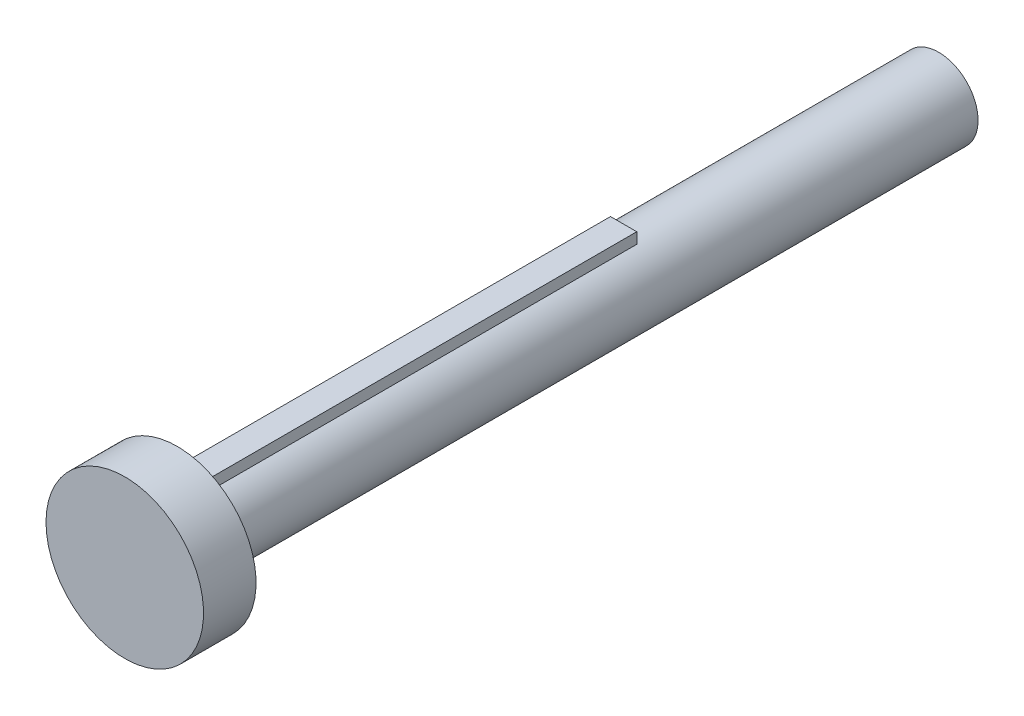
ISO-10303-21;
HEADER;
FILE_DESCRIPTION(('STEP AP214'),'2;1');
FILE_NAME('part.step','',(''),(''),'','','');
FILE_SCHEMA(('AUTOMOTIVE_DESIGN { 1 0 10303 214 1 1 1 1 }'));
ENDSEC;
DATA;
#1=APPLICATION_CONTEXT('core data for automotive mechanical design processes');
#2=APPLICATION_PROTOCOL_DEFINITION('international standard','automotive_design',2000,#1);
#3=PRODUCT_CONTEXT('',#1,'mechanical');
#4=PRODUCT('Part','Part','',(#3));
#5=PRODUCT_RELATED_PRODUCT_CATEGORY('part','',(#4));
#6=PRODUCT_DEFINITION_FORMATION('','',#4);
#7=PRODUCT_DEFINITION_CONTEXT('part definition',#1,'design');
#8=PRODUCT_DEFINITION('design','',#6,#7);
#9=PRODUCT_DEFINITION_SHAPE('','',#8);
#10=(LENGTH_UNIT() NAMED_UNIT(*) SI_UNIT(.MILLI.,.METRE.));
#11=(NAMED_UNIT(*) PLANE_ANGLE_UNIT() SI_UNIT($,.RADIAN.));
#12=(NAMED_UNIT(*) SI_UNIT($,.STERADIAN.) SOLID_ANGLE_UNIT());
#13=UNCERTAINTY_MEASURE_WITH_UNIT(LENGTH_MEASURE(1.E-05),#10,'distance_accuracy_value','');
#14=(GEOMETRIC_REPRESENTATION_CONTEXT(3) GLOBAL_UNCERTAINTY_ASSIGNED_CONTEXT((#13)) GLOBAL_UNIT_ASSIGNED_CONTEXT((#10,
#11,#12)) REPRESENTATION_CONTEXT('',''));
#15=CARTESIAN_POINT('',(0.,0.,0.));
#16=DIRECTION('',(0.,0.,1.));
#17=DIRECTION('',(1.,0.,0.));
#18=AXIS2_PLACEMENT_3D('',#15,#16,#17);
#19=CARTESIAN_POINT('',(5.,18.3,800.));
#20=DIRECTION('',(-1.,0.,0.));
#21=DIRECTION('',(0.,0.,1.));
#22=AXIS2_PLACEMENT_3D('',#19,#20,#21);
#23=PLANE('',#22);
#24=DIRECTION('',(0.,-1.,0.));
#25=VECTOR('',#24,1.);
#26=CARTESIAN_POINT('',(5.,18.3,-780.));
#27=LINE('',#26,#25);
#28=CARTESIAN_POINT('',(5.,18.3,-780.));
#29=VERTEX_POINT('',#28);
#30=CARTESIAN_POINT('',(5.,14.1421356237309,-780.));
#31=VERTEX_POINT('',#30);
#32=EDGE_CURVE('E91',#29,#31,#27,.T.);
#33=ORIENTED_EDGE('',*,*,#32,.F.);
#34=DIRECTION('',(0.,0.,-1.));
#35=VECTOR('',#34,1.);
#36=CARTESIAN_POINT('',(5.,18.3,800.));
#37=LINE('',#36,#35);
#38=CARTESIAN_POINT('',(5.,18.3,-610.));
#39=VERTEX_POINT('',#38);
#40=EDGE_CURVE('E90',#39,#29,#37,.T.);
#41=ORIENTED_EDGE('',*,*,#40,.F.);
#42=DIRECTION('',(0.,1.,0.));
#43=VECTOR('',#42,1.);
#44=CARTESIAN_POINT('',(5.,18.3,-610.));
#45=LINE('',#44,#43);
#46=CARTESIAN_POINT('',(5.,14.1421356237309,-610.));
#47=VERTEX_POINT('',#46);
#48=EDGE_CURVE('E103',#47,#39,#45,.T.);
#49=ORIENTED_EDGE('',*,*,#48,.F.);
#50=DIRECTION('',(0.,0.,-1.));
#51=VECTOR('',#50,1.);
#52=CARTESIAN_POINT('',(5.,14.1421356237309,800.));
#53=LINE('',#52,#51);
#54=EDGE_CURVE('E45',#47,#31,#53,.T.);
#55=ORIENTED_EDGE('',*,*,#54,.T.);
#56=EDGE_LOOP('',(#33,#41,#49,#55));
#57=FACE_BOUND('',#56,.T.);
#58=ADVANCED_FACE('F37',(#57),#23,.F.);
#59=CARTESIAN_POINT('',(-5.,18.3,800.));
#60=DIRECTION('',(0.,-1.,0.));
#61=DIRECTION('',(0.,0.,-1.));
#62=AXIS2_PLACEMENT_3D('',#59,#60,#61);
#63=PLANE('',#62);
#64=DIRECTION('',(1.,0.,0.));
#65=VECTOR('',#64,1.);
#66=CARTESIAN_POINT('',(-5.,18.3,-780.));
#67=LINE('',#66,#65);
#68=CARTESIAN_POINT('',(-5.,18.3,-780.));
#69=VERTEX_POINT('',#68);
#70=EDGE_CURVE('E80',#69,#29,#67,.T.);
#71=ORIENTED_EDGE('',*,*,#70,.F.);
#72=DIRECTION('',(0.,0.,-1.));
#73=VECTOR('',#72,1.);
#74=CARTESIAN_POINT('',(-5.,18.3,800.));
#75=LINE('',#74,#73);
#76=CARTESIAN_POINT('',(-5.,18.3,-610.));
#77=VERTEX_POINT('',#76);
#78=EDGE_CURVE('E87',#77,#69,#75,.T.);
#79=ORIENTED_EDGE('',*,*,#78,.F.);
#80=DIRECTION('',(-1.,0.,0.));
#81=VECTOR('',#80,1.);
#82=CARTESIAN_POINT('',(-5.,18.3,-610.));
#83=LINE('',#82,#81);
#84=EDGE_CURVE('E119',#39,#77,#83,.T.);
#85=ORIENTED_EDGE('',*,*,#84,.F.);
#86=ORIENTED_EDGE('',*,*,#40,.T.);
#87=EDGE_LOOP('',(#71,#79,#85,#86));
#88=FACE_BOUND('',#87,.T.);
#89=ADVANCED_FACE('F86',(#88),#63,.F.);
#90=CARTESIAN_POINT('',(-5.,14.1421356237309,800.));
#91=DIRECTION('',(1.,0.,0.));
#92=DIRECTION('',(0.,1.,0.));
#93=AXIS2_PLACEMENT_3D('',#90,#91,#92);
#94=PLANE('',#93);
#95=DIRECTION('',(0.,1.,0.));
#96=VECTOR('',#95,1.);
#97=CARTESIAN_POINT('',(-5.,14.1421356237309,-780.));
#98=LINE('',#97,#96);
#99=CARTESIAN_POINT('',(-5.,14.1421356237309,-780.));
#100=VERTEX_POINT('',#99);
#101=EDGE_CURVE('E77',#100,#69,#98,.T.);
#102=ORIENTED_EDGE('',*,*,#101,.F.);
#103=DIRECTION('',(0.,0.,-1.));
#104=VECTOR('',#103,1.);
#105=CARTESIAN_POINT('',(-5.,14.1421356237309,800.));
#106=LINE('',#105,#104);
#107=CARTESIAN_POINT('',(-5.,14.1421356237309,-610.));
#108=VERTEX_POINT('',#107);
#109=EDGE_CURVE('E94',#108,#100,#106,.T.);
#110=ORIENTED_EDGE('',*,*,#109,.F.);
#111=DIRECTION('',(0.,-1.,0.));
#112=VECTOR('',#111,1.);
#113=CARTESIAN_POINT('',(-5.,14.1421356237309,-610.));
#114=LINE('',#113,#112);
#115=EDGE_CURVE('E60',#77,#108,#114,.T.);
#116=ORIENTED_EDGE('',*,*,#115,.F.);
#117=ORIENTED_EDGE('',*,*,#78,.T.);
#118=EDGE_LOOP('',(#102,#110,#116,#117));
#119=FACE_BOUND('',#118,.T.);
#120=ADVANCED_FACE('F93',(#119),#94,.F.);
#121=CARTESIAN_POINT('',(0.,0.,-610.));
#122=DIRECTION('',(0.,0.,1.));
#123=DIRECTION('',(1.,0.,0.));
#124=AXIS2_PLACEMENT_3D('',#121,#122,#123);
#125=CYLINDRICAL_SURFACE('',#124,30.);
#126=CARTESIAN_POINT('',(0.,0.,-610.));
#127=DIRECTION('',(0.,0.,-1.));
#128=DIRECTION('',(-1.,0.,0.));
#129=AXIS2_PLACEMENT_3D('',#126,#127,#128);
#130=CIRCLE('',#129,30.);
#131=CARTESIAN_POINT('',(-30.,0.,-610.));
#132=VERTEX_POINT('',#131);
#133=EDGE_CURVE('E113',#132,#132,#130,.T.);
#134=ORIENTED_EDGE('',*,*,#133,.F.);
#135=EDGE_LOOP('',(#134));
#136=FACE_BOUND('',#135,.T.);
#137=CARTESIAN_POINT('',(0.,0.,-590.));
#138=DIRECTION('',(0.,0.,-1.));
#139=DIRECTION('',(-1.,0.,0.));
#140=AXIS2_PLACEMENT_3D('',#137,#138,#139);
#141=CIRCLE('',#140,30.);
#142=CARTESIAN_POINT('',(-30.,0.,-590.));
#143=VERTEX_POINT('',#142);
#144=EDGE_CURVE('E110',#143,#143,#141,.T.);
#145=ORIENTED_EDGE('',*,*,#144,.T.);
#146=EDGE_LOOP('',(#145));
#147=FACE_BOUND('',#146,.T.);
#148=ADVANCED_FACE('F125',(#136,#147),#125,.T.);
#149=CARTESIAN_POINT('',(0.,0.,-610.));
#150=DIRECTION('',(0.,0.,1.));
#151=DIRECTION('',(-1.,0.,0.));
#152=AXIS2_PLACEMENT_3D('',#149,#150,#151);
#153=PLANE('',#152);
#154=ORIENTED_EDGE('',*,*,#84,.T.);
#155=ORIENTED_EDGE('',*,*,#115,.T.);
#156=CARTESIAN_POINT('',(0.,0.,-610.));
#157=DIRECTION('',(0.,0.,1.));
#158=DIRECTION('',(1.,0.,0.));
#159=AXIS2_PLACEMENT_3D('',#156,#157,#158);
#160=CIRCLE('',#159,15.);
#161=EDGE_CURVE('E11',#108,#47,#160,.T.);
#162=ORIENTED_EDGE('',*,*,#161,.T.);
#163=ORIENTED_EDGE('',*,*,#48,.T.);
#164=EDGE_LOOP('',(#154,#155,#162,#163));
#165=FACE_BOUND('',#164,.T.);
#166=ORIENTED_EDGE('',*,*,#133,.T.);
#167=EDGE_LOOP('',(#166));
#168=FACE_BOUND('',#167,.T.);
#169=ADVANCED_FACE('F121',(#165,#168),#153,.F.);
#170=CARTESIAN_POINT('',(0.,0.,-590.));
#171=DIRECTION('',(0.,0.,1.));
#172=DIRECTION('',(-1.,0.,0.));
#173=AXIS2_PLACEMENT_3D('',#170,#171,#172);
#174=PLANE('',#173);
#175=ORIENTED_EDGE('',*,*,#144,.F.);
#176=EDGE_LOOP('',(#175));
#177=FACE_BOUND('',#176,.T.);
#178=ADVANCED_FACE('F124',(#177),#174,.T.);
#179=CARTESIAN_POINT('',(0.,0.,800.));
#180=DIRECTION('',(0.,0.,-1.));
#181=DIRECTION('',(-1.,0.,0.));
#182=AXIS2_PLACEMENT_3D('',#179,#180,#181);
#183=CYLINDRICAL_SURFACE('',#182,15.);
#184=ORIENTED_EDGE('',*,*,#161,.F.);
#185=ORIENTED_EDGE('',*,*,#109,.T.);
#186=CARTESIAN_POINT('',(0.,0.,-780.));
#187=DIRECTION('',(0.,0.,1.));
#188=DIRECTION('',(-1.,0.,0.));
#189=AXIS2_PLACEMENT_3D('',#186,#187,#188);
#190=CIRCLE('',#189,15.);
#191=EDGE_CURVE('E52',#31,#100,#190,.T.);
#192=ORIENTED_EDGE('',*,*,#191,.F.);
#193=ORIENTED_EDGE('',*,*,#54,.F.);
#194=EDGE_LOOP('',(#184,#185,#192,#193));
#195=FACE_BOUND('',#194,.T.);
#196=CARTESIAN_POINT('',(0.,0.,-900.));
#197=DIRECTION('',(0.,0.,-1.));
#198=DIRECTION('',(-1.,0.,0.));
#199=AXIS2_PLACEMENT_3D('',#196,#197,#198);
#200=CIRCLE('',#199,15.);
#201=CARTESIAN_POINT('',(-15.,0.,-900.));
#202=VERTEX_POINT('',#201);
#203=EDGE_CURVE('E107',#202,#202,#200,.T.);
#204=ORIENTED_EDGE('',*,*,#203,.F.);
#205=EDGE_LOOP('',(#204));
#206=FACE_BOUND('',#205,.T.);
#207=ADVANCED_FACE('F39',(#195,#206),#183,.T.);
#208=CARTESIAN_POINT('',(0.,0.,-900.));
#209=DIRECTION('',(0.,0.,-1.));
#210=DIRECTION('',(-1.,0.,0.));
#211=AXIS2_PLACEMENT_3D('',#208,#209,#210);
#212=PLANE('',#211);
#213=ORIENTED_EDGE('',*,*,#203,.T.);
#214=EDGE_LOOP('',(#213));
#215=FACE_BOUND('',#214,.T.);
#216=ADVANCED_FACE('F140',(#215),#212,.T.);
#217=CARTESIAN_POINT('',(0.,0.,-780.));
#218=DIRECTION('',(0.,0.,-1.));
#219=DIRECTION('',(-1.,0.,0.));
#220=AXIS2_PLACEMENT_3D('',#217,#218,#219);
#221=PLANE('',#220);
#222=ORIENTED_EDGE('',*,*,#191,.T.);
#223=ORIENTED_EDGE('',*,*,#101,.T.);
#224=ORIENTED_EDGE('',*,*,#70,.T.);
#225=ORIENTED_EDGE('',*,*,#32,.T.);
#226=EDGE_LOOP('',(#222,#223,#224,#225));
#227=FACE_BOUND('',#226,.T.);
#228=ADVANCED_FACE('F79',(#227),#221,.T.);
#229=CLOSED_SHELL('',(#58,#89,#120,#148,#169,#178,#207,#216,#228));
#230=MANIFOLD_SOLID_BREP('B2',#229);
#231=ADVANCED_BREP_SHAPE_REPRESENTATION('',(#18,#230),#14);
#232=SHAPE_DEFINITION_REPRESENTATION(#9,#231);
ENDSEC;
END-ISO-10303-21;
